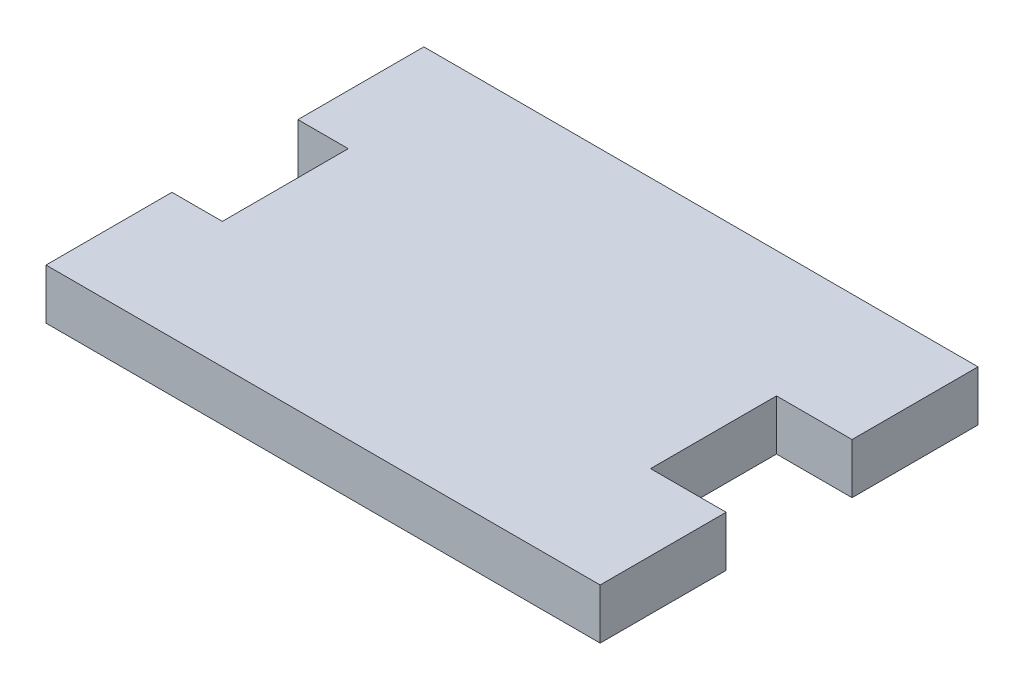
ISO-10303-21;
HEADER;
FILE_DESCRIPTION(('STEP AP214'),'2;1');
FILE_NAME('part.step','',(''),(''),'','','');
FILE_SCHEMA(('AUTOMOTIVE_DESIGN { 1 0 10303 214 1 1 1 1 }'));
ENDSEC;
DATA;
#1=APPLICATION_CONTEXT('core data for automotive mechanical design processes');
#2=APPLICATION_PROTOCOL_DEFINITION('international standard','automotive_design',2000,#1);
#3=PRODUCT_CONTEXT('',#1,'mechanical');
#4=PRODUCT('Part','Part','',(#3));
#5=PRODUCT_RELATED_PRODUCT_CATEGORY('part','',(#4));
#6=PRODUCT_DEFINITION_FORMATION('','',#4);
#7=PRODUCT_DEFINITION_CONTEXT('part definition',#1,'design');
#8=PRODUCT_DEFINITION('design','',#6,#7);
#9=PRODUCT_DEFINITION_SHAPE('','',#8);
#10=(LENGTH_UNIT() NAMED_UNIT(*) SI_UNIT(.MILLI.,.METRE.));
#11=(NAMED_UNIT(*) PLANE_ANGLE_UNIT() SI_UNIT($,.RADIAN.));
#12=(NAMED_UNIT(*) SI_UNIT($,.STERADIAN.) SOLID_ANGLE_UNIT());
#13=UNCERTAINTY_MEASURE_WITH_UNIT(LENGTH_MEASURE(1.E-05),#10,'distance_accuracy_value','');
#14=(GEOMETRIC_REPRESENTATION_CONTEXT(3) GLOBAL_UNCERTAINTY_ASSIGNED_CONTEXT((#13)) GLOBAL_UNIT_ASSIGNED_CONTEXT((#10,
#11,#12)) REPRESENTATION_CONTEXT('',''));
#15=CARTESIAN_POINT('',(0.,0.,0.));
#16=DIRECTION('',(0.,0.,1.));
#17=DIRECTION('',(1.,0.,0.));
#18=AXIS2_PLACEMENT_3D('',#15,#16,#17);
#19=CARTESIAN_POINT('',(11.,2.,7.5));
#20=DIRECTION('',(-1.,0.,0.));
#21=DIRECTION('',(0.,0.,1.));
#22=AXIS2_PLACEMENT_3D('',#19,#20,#21);
#23=PLANE('',#22);
#24=DIRECTION('',(0.,0.,-1.));
#25=VECTOR('',#24,1.);
#26=CARTESIAN_POINT('',(11.,0.,7.5));
#27=LINE('',#26,#25);
#28=CARTESIAN_POINT('',(11.,0.,7.5));
#29=VERTEX_POINT('',#28);
#30=CARTESIAN_POINT('',(11.,0.,2.5));
#31=VERTEX_POINT('',#30);
#32=EDGE_CURVE('E146',#29,#31,#27,.T.);
#33=ORIENTED_EDGE('',*,*,#32,.T.);
#34=DIRECTION('',(0.,1.,0.));
#35=VECTOR('',#34,1.);
#36=CARTESIAN_POINT('',(11.,0.,2.5));
#37=LINE('',#36,#35);
#38=CARTESIAN_POINT('',(11.,2.,2.5));
#39=VERTEX_POINT('',#38);
#40=EDGE_CURVE('E185',#31,#39,#37,.T.);
#41=ORIENTED_EDGE('',*,*,#40,.T.);
#42=DIRECTION('',(0.,0.,-1.));
#43=VECTOR('',#42,1.);
#44=CARTESIAN_POINT('',(11.,2.,7.5));
#45=LINE('',#44,#43);
#46=CARTESIAN_POINT('',(11.,2.,7.5));
#47=VERTEX_POINT('',#46);
#48=EDGE_CURVE('E168',#47,#39,#45,.T.);
#49=ORIENTED_EDGE('',*,*,#48,.F.);
#50=DIRECTION('',(0.,-1.,0.));
#51=VECTOR('',#50,1.);
#52=CARTESIAN_POINT('',(11.,2.,7.5));
#53=LINE('',#52,#51);
#54=EDGE_CURVE('E42',#47,#29,#53,.T.);
#55=ORIENTED_EDGE('',*,*,#54,.T.);
#56=EDGE_LOOP('',(#33,#41,#49,#55));
#57=FACE_BOUND('',#56,.T.);
#58=ADVANCED_FACE('F34',(#57),#23,.F.);
#59=CARTESIAN_POINT('',(-11.,2.,7.5));
#60=DIRECTION('',(1.,0.,0.));
#61=DIRECTION('',(0.,0.,-1.));
#62=AXIS2_PLACEMENT_3D('',#59,#60,#61);
#63=PLANE('',#62);
#64=DIRECTION('',(0.,0.,1.));
#65=VECTOR('',#64,1.);
#66=CARTESIAN_POINT('',(-11.,0.,7.5));
#67=LINE('',#66,#65);
#68=CARTESIAN_POINT('',(-11.,0.,-7.5));
#69=VERTEX_POINT('',#68);
#70=CARTESIAN_POINT('',(-11.,0.,-2.5));
#71=VERTEX_POINT('',#70);
#72=EDGE_CURVE('E150',#69,#71,#67,.T.);
#73=ORIENTED_EDGE('',*,*,#72,.T.);
#74=DIRECTION('',(0.,1.,0.));
#75=VECTOR('',#74,1.);
#76=CARTESIAN_POINT('',(-11.,0.,-2.5));
#77=LINE('',#76,#75);
#78=CARTESIAN_POINT('',(-11.,2.,-2.5));
#79=VERTEX_POINT('',#78);
#80=EDGE_CURVE('E206',#71,#79,#77,.T.);
#81=ORIENTED_EDGE('',*,*,#80,.T.);
#82=DIRECTION('',(0.,0.,1.));
#83=VECTOR('',#82,1.);
#84=CARTESIAN_POINT('',(-11.,2.,7.5));
#85=LINE('',#84,#83);
#86=CARTESIAN_POINT('',(-11.,2.,-7.5));
#87=VERTEX_POINT('',#86);
#88=EDGE_CURVE('E215',#87,#79,#85,.T.);
#89=ORIENTED_EDGE('',*,*,#88,.F.);
#90=DIRECTION('',(0.,-1.,0.));
#91=VECTOR('',#90,1.);
#92=CARTESIAN_POINT('',(-11.,2.,-7.5));
#93=LINE('',#92,#91);
#94=EDGE_CURVE('E156',#87,#69,#93,.T.);
#95=ORIENTED_EDGE('',*,*,#94,.T.);
#96=EDGE_LOOP('',(#73,#81,#89,#95));
#97=FACE_BOUND('',#96,.T.);
#98=ADVANCED_FACE('F240',(#97),#63,.F.);
#99=CARTESIAN_POINT('',(-11.,2.,2.5));
#100=VERTEX_POINT('',#99);
#101=CARTESIAN_POINT('',(-11.,2.,7.5));
#102=VERTEX_POINT('',#101);
#103=EDGE_CURVE('E155',#100,#102,#85,.T.);
#104=ORIENTED_EDGE('',*,*,#103,.F.);
#105=DIRECTION('',(0.,1.,0.));
#106=VECTOR('',#105,1.);
#107=CARTESIAN_POINT('',(-11.,0.,2.5));
#108=LINE('',#107,#106);
#109=CARTESIAN_POINT('',(-11.,0.,2.5));
#110=VERTEX_POINT('',#109);
#111=EDGE_CURVE('E199',#110,#100,#108,.T.);
#112=ORIENTED_EDGE('',*,*,#111,.F.);
#113=CARTESIAN_POINT('',(-11.,0.,7.5));
#114=VERTEX_POINT('',#113);
#115=EDGE_CURVE('E209',#110,#114,#67,.T.);
#116=ORIENTED_EDGE('',*,*,#115,.T.);
#117=DIRECTION('',(0.,-1.,0.));
#118=VECTOR('',#117,1.);
#119=CARTESIAN_POINT('',(-11.,2.,7.5));
#120=LINE('',#119,#118);
#121=EDGE_CURVE('E11',#102,#114,#120,.T.);
#122=ORIENTED_EDGE('',*,*,#121,.F.);
#123=EDGE_LOOP('',(#104,#112,#116,#122));
#124=FACE_BOUND('',#123,.T.);
#125=ADVANCED_FACE('F36',(#124),#63,.F.);
#126=CARTESIAN_POINT('',(11.,2.,7.5));
#127=DIRECTION('',(0.,0.,-1.));
#128=DIRECTION('',(-1.,0.,0.));
#129=AXIS2_PLACEMENT_3D('',#126,#127,#128);
#130=PLANE('',#129);
#131=DIRECTION('',(1.,0.,0.));
#132=VECTOR('',#131,1.);
#133=CARTESIAN_POINT('',(11.,0.,7.5));
#134=LINE('',#133,#132);
#135=EDGE_CURVE('E147',#114,#29,#134,.T.);
#136=ORIENTED_EDGE('',*,*,#135,.T.);
#137=ORIENTED_EDGE('',*,*,#54,.F.);
#138=DIRECTION('',(1.,0.,0.));
#139=VECTOR('',#138,1.);
#140=CARTESIAN_POINT('',(11.,2.,7.5));
#141=LINE('',#140,#139);
#142=EDGE_CURVE('E218',#102,#47,#141,.T.);
#143=ORIENTED_EDGE('',*,*,#142,.F.);
#144=ORIENTED_EDGE('',*,*,#121,.T.);
#145=EDGE_LOOP('',(#136,#137,#143,#144));
#146=FACE_BOUND('',#145,.T.);
#147=ADVANCED_FACE('F248',(#146),#130,.F.);
#148=CARTESIAN_POINT('',(11.,2.,-2.5));
#149=VERTEX_POINT('',#148);
#150=CARTESIAN_POINT('',(11.,2.,-7.5));
#151=VERTEX_POINT('',#150);
#152=EDGE_CURVE('E139',#149,#151,#45,.T.);
#153=ORIENTED_EDGE('',*,*,#152,.F.);
#154=DIRECTION('',(0.,1.,0.));
#155=VECTOR('',#154,1.);
#156=CARTESIAN_POINT('',(11.,0.,-2.5));
#157=LINE('',#156,#155);
#158=CARTESIAN_POINT('',(11.,0.,-2.5));
#159=VERTEX_POINT('',#158);
#160=EDGE_CURVE('E126',#159,#149,#157,.T.);
#161=ORIENTED_EDGE('',*,*,#160,.F.);
#162=CARTESIAN_POINT('',(11.,0.,-7.5));
#163=VERTEX_POINT('',#162);
#164=EDGE_CURVE('E137',#159,#163,#27,.T.);
#165=ORIENTED_EDGE('',*,*,#164,.T.);
#166=DIRECTION('',(0.,-1.,0.));
#167=VECTOR('',#166,1.);
#168=CARTESIAN_POINT('',(11.,2.,-7.5));
#169=LINE('',#168,#167);
#170=EDGE_CURVE('E159',#151,#163,#169,.T.);
#171=ORIENTED_EDGE('',*,*,#170,.F.);
#172=EDGE_LOOP('',(#153,#161,#165,#171));
#173=FACE_BOUND('',#172,.T.);
#174=ADVANCED_FACE('F135',(#173),#23,.F.);
#175=CARTESIAN_POINT('',(11.,2.,-7.5));
#176=DIRECTION('',(0.,0.,1.));
#177=DIRECTION('',(1.,0.,0.));
#178=AXIS2_PLACEMENT_3D('',#175,#176,#177);
#179=PLANE('',#178);
#180=DIRECTION('',(-1.,0.,0.));
#181=VECTOR('',#180,1.);
#182=CARTESIAN_POINT('',(11.,0.,-7.5));
#183=LINE('',#182,#181);
#184=EDGE_CURVE('E145',#163,#69,#183,.T.);
#185=ORIENTED_EDGE('',*,*,#184,.T.);
#186=ORIENTED_EDGE('',*,*,#94,.F.);
#187=DIRECTION('',(-1.,0.,0.));
#188=VECTOR('',#187,1.);
#189=CARTESIAN_POINT('',(11.,2.,-7.5));
#190=LINE('',#189,#188);
#191=EDGE_CURVE('E160',#151,#87,#190,.T.);
#192=ORIENTED_EDGE('',*,*,#191,.F.);
#193=ORIENTED_EDGE('',*,*,#170,.T.);
#194=EDGE_LOOP('',(#185,#186,#192,#193));
#195=FACE_BOUND('',#194,.T.);
#196=ADVANCED_FACE('F244',(#195),#179,.F.);
#197=CARTESIAN_POINT('',(0.,2.,0.));
#198=DIRECTION('',(0.,1.,0.));
#199=DIRECTION('',(0.,0.,1.));
#200=AXIS2_PLACEMENT_3D('',#197,#198,#199);
#201=PLANE('',#200);
#202=DIRECTION('',(1.,0.,0.));
#203=VECTOR('',#202,1.);
#204=CARTESIAN_POINT('',(11.,2.,2.5));
#205=LINE('',#204,#203);
#206=CARTESIAN_POINT('',(8.,2.,2.5));
#207=VERTEX_POINT('',#206);
#208=EDGE_CURVE('E131',#207,#39,#205,.T.);
#209=ORIENTED_EDGE('',*,*,#208,.F.);
#210=DIRECTION('',(0.,0.,1.));
#211=VECTOR('',#210,1.);
#212=CARTESIAN_POINT('',(8.,2.,-2.5));
#213=LINE('',#212,#211);
#214=CARTESIAN_POINT('',(8.,2.,-2.5));
#215=VERTEX_POINT('',#214);
#216=EDGE_CURVE('E181',#215,#207,#213,.T.);
#217=ORIENTED_EDGE('',*,*,#216,.F.);
#218=DIRECTION('',(-1.,0.,0.));
#219=VECTOR('',#218,1.);
#220=CARTESIAN_POINT('',(11.,2.,-2.5));
#221=LINE('',#220,#219);
#222=EDGE_CURVE('E179',#149,#215,#221,.T.);
#223=ORIENTED_EDGE('',*,*,#222,.F.);
#224=ORIENTED_EDGE('',*,*,#152,.T.);
#225=ORIENTED_EDGE('',*,*,#191,.T.);
#226=ORIENTED_EDGE('',*,*,#88,.T.);
#227=DIRECTION('',(-1.,0.,0.));
#228=VECTOR('',#227,1.);
#229=CARTESIAN_POINT('',(-9.,2.,-2.5));
#230=LINE('',#229,#228);
#231=CARTESIAN_POINT('',(-9.,2.,-2.5));
#232=VERTEX_POINT('',#231);
#233=EDGE_CURVE('E194',#232,#79,#230,.T.);
#234=ORIENTED_EDGE('',*,*,#233,.F.);
#235=DIRECTION('',(0.,0.,-1.));
#236=VECTOR('',#235,1.);
#237=CARTESIAN_POINT('',(-9.,2.,2.5));
#238=LINE('',#237,#236);
#239=CARTESIAN_POINT('',(-9.,2.,2.5));
#240=VERTEX_POINT('',#239);
#241=EDGE_CURVE('E202',#240,#232,#238,.T.);
#242=ORIENTED_EDGE('',*,*,#241,.F.);
#243=DIRECTION('',(1.,0.,0.));
#244=VECTOR('',#243,1.);
#245=CARTESIAN_POINT('',(-9.,2.,2.5));
#246=LINE('',#245,#244);
#247=EDGE_CURVE('E187',#100,#240,#246,.T.);
#248=ORIENTED_EDGE('',*,*,#247,.F.);
#249=ORIENTED_EDGE('',*,*,#103,.T.);
#250=ORIENTED_EDGE('',*,*,#142,.T.);
#251=ORIENTED_EDGE('',*,*,#48,.T.);
#252=EDGE_LOOP('',(#209,#217,#223,#224,#225,#226,#234,#242,#248,#249,#250,#251));
#253=FACE_BOUND('',#252,.T.);
#254=ADVANCED_FACE('F236',(#253),#201,.T.);
#255=CARTESIAN_POINT('',(0.,0.,0.));
#256=DIRECTION('',(0.,1.,0.));
#257=DIRECTION('',(0.,0.,1.));
#258=AXIS2_PLACEMENT_3D('',#255,#256,#257);
#259=PLANE('',#258);
#260=DIRECTION('',(0.,0.,1.));
#261=VECTOR('',#260,1.);
#262=CARTESIAN_POINT('',(8.,0.,-2.5));
#263=LINE('',#262,#261);
#264=CARTESIAN_POINT('',(8.,0.,-2.5));
#265=VERTEX_POINT('',#264);
#266=CARTESIAN_POINT('',(8.,0.,2.5));
#267=VERTEX_POINT('',#266);
#268=EDGE_CURVE('E49',#265,#267,#263,.T.);
#269=ORIENTED_EDGE('',*,*,#268,.T.);
#270=DIRECTION('',(1.,0.,0.));
#271=VECTOR('',#270,1.);
#272=CARTESIAN_POINT('',(11.,0.,2.5));
#273=LINE('',#272,#271);
#274=EDGE_CURVE('E140',#267,#31,#273,.T.);
#275=ORIENTED_EDGE('',*,*,#274,.T.);
#276=ORIENTED_EDGE('',*,*,#32,.F.);
#277=ORIENTED_EDGE('',*,*,#135,.F.);
#278=ORIENTED_EDGE('',*,*,#115,.F.);
#279=DIRECTION('',(1.,0.,0.));
#280=VECTOR('',#279,1.);
#281=CARTESIAN_POINT('',(-9.,0.,2.5));
#282=LINE('',#281,#280);
#283=CARTESIAN_POINT('',(-9.,0.,2.5));
#284=VERTEX_POINT('',#283);
#285=EDGE_CURVE('E191',#110,#284,#282,.T.);
#286=ORIENTED_EDGE('',*,*,#285,.T.);
#287=DIRECTION('',(0.,0.,-1.));
#288=VECTOR('',#287,1.);
#289=CARTESIAN_POINT('',(-9.,0.,2.5));
#290=LINE('',#289,#288);
#291=CARTESIAN_POINT('',(-9.,0.,-2.5));
#292=VERTEX_POINT('',#291);
#293=EDGE_CURVE('E57',#284,#292,#290,.T.);
#294=ORIENTED_EDGE('',*,*,#293,.T.);
#295=DIRECTION('',(-1.,0.,0.));
#296=VECTOR('',#295,1.);
#297=CARTESIAN_POINT('',(-9.,0.,-2.5));
#298=LINE('',#297,#296);
#299=EDGE_CURVE('E196',#292,#71,#298,.T.);
#300=ORIENTED_EDGE('',*,*,#299,.T.);
#301=ORIENTED_EDGE('',*,*,#72,.F.);
#302=ORIENTED_EDGE('',*,*,#184,.F.);
#303=ORIENTED_EDGE('',*,*,#164,.F.);
#304=DIRECTION('',(-1.,0.,0.));
#305=VECTOR('',#304,1.);
#306=CARTESIAN_POINT('',(11.,0.,-2.5));
#307=LINE('',#306,#305);
#308=EDGE_CURVE('E122',#159,#265,#307,.T.);
#309=ORIENTED_EDGE('',*,*,#308,.T.);
#310=EDGE_LOOP('',(#269,#275,#276,#277,#278,#286,#294,#300,#301,#302,#303,#309));
#311=FACE_BOUND('',#310,.T.);
#312=ADVANCED_FACE('F143',(#311),#259,.F.);
#313=CARTESIAN_POINT('',(-9.,0.,-2.5));
#314=DIRECTION('',(0.,0.,-1.));
#315=DIRECTION('',(-1.,0.,0.));
#316=AXIS2_PLACEMENT_3D('',#313,#314,#315);
#317=PLANE('',#316);
#318=ORIENTED_EDGE('',*,*,#233,.T.);
#319=ORIENTED_EDGE('',*,*,#80,.F.);
#320=ORIENTED_EDGE('',*,*,#299,.F.);
#321=DIRECTION('',(0.,1.,0.));
#322=VECTOR('',#321,1.);
#323=CARTESIAN_POINT('',(-9.,0.,-2.5));
#324=LINE('',#323,#322);
#325=EDGE_CURVE('E210',#292,#232,#324,.T.);
#326=ORIENTED_EDGE('',*,*,#325,.T.);
#327=EDGE_LOOP('',(#318,#319,#320,#326));
#328=FACE_BOUND('',#327,.T.);
#329=ADVANCED_FACE('F239',(#328),#317,.F.);
#330=CARTESIAN_POINT('',(-9.,0.,2.5));
#331=DIRECTION('',(1.,0.,0.));
#332=DIRECTION('',(0.,0.,-1.));
#333=AXIS2_PLACEMENT_3D('',#330,#331,#332);
#334=PLANE('',#333);
#335=ORIENTED_EDGE('',*,*,#241,.T.);
#336=ORIENTED_EDGE('',*,*,#325,.F.);
#337=ORIENTED_EDGE('',*,*,#293,.F.);
#338=DIRECTION('',(0.,1.,0.));
#339=VECTOR('',#338,1.);
#340=CARTESIAN_POINT('',(-9.,0.,2.5));
#341=LINE('',#340,#339);
#342=EDGE_CURVE('E212',#284,#240,#341,.T.);
#343=ORIENTED_EDGE('',*,*,#342,.T.);
#344=EDGE_LOOP('',(#335,#336,#337,#343));
#345=FACE_BOUND('',#344,.T.);
#346=ADVANCED_FACE('F231',(#345),#334,.F.);
#347=CARTESIAN_POINT('',(-9.,0.,2.5));
#348=DIRECTION('',(0.,0.,1.));
#349=DIRECTION('',(1.,0.,0.));
#350=AXIS2_PLACEMENT_3D('',#347,#348,#349);
#351=PLANE('',#350);
#352=ORIENTED_EDGE('',*,*,#247,.T.);
#353=ORIENTED_EDGE('',*,*,#342,.F.);
#354=ORIENTED_EDGE('',*,*,#285,.F.);
#355=ORIENTED_EDGE('',*,*,#111,.T.);
#356=EDGE_LOOP('',(#352,#353,#354,#355));
#357=FACE_BOUND('',#356,.T.);
#358=ADVANCED_FACE('F228',(#357),#351,.F.);
#359=CARTESIAN_POINT('',(11.,0.,2.5));
#360=DIRECTION('',(0.,0.,1.));
#361=DIRECTION('',(1.,0.,0.));
#362=AXIS2_PLACEMENT_3D('',#359,#360,#361);
#363=PLANE('',#362);
#364=ORIENTED_EDGE('',*,*,#208,.T.);
#365=ORIENTED_EDGE('',*,*,#40,.F.);
#366=ORIENTED_EDGE('',*,*,#274,.F.);
#367=DIRECTION('',(0.,1.,0.));
#368=VECTOR('',#367,1.);
#369=CARTESIAN_POINT('',(8.,0.,2.5));
#370=LINE('',#369,#368);
#371=EDGE_CURVE('E188',#267,#207,#370,.T.);
#372=ORIENTED_EDGE('',*,*,#371,.T.);
#373=EDGE_LOOP('',(#364,#365,#366,#372));
#374=FACE_BOUND('',#373,.T.);
#375=ADVANCED_FACE('F247',(#374),#363,.F.);
#376=CARTESIAN_POINT('',(8.,0.,-2.5));
#377=DIRECTION('',(-1.,0.,0.));
#378=DIRECTION('',(0.,0.,1.));
#379=AXIS2_PLACEMENT_3D('',#376,#377,#378);
#380=PLANE('',#379);
#381=ORIENTED_EDGE('',*,*,#216,.T.);
#382=ORIENTED_EDGE('',*,*,#371,.F.);
#383=ORIENTED_EDGE('',*,*,#268,.F.);
#384=DIRECTION('',(0.,1.,0.));
#385=VECTOR('',#384,1.);
#386=CARTESIAN_POINT('',(8.,0.,-2.5));
#387=LINE('',#386,#385);
#388=EDGE_CURVE('E128',#265,#215,#387,.T.);
#389=ORIENTED_EDGE('',*,*,#388,.T.);
#390=EDGE_LOOP('',(#381,#382,#383,#389));
#391=FACE_BOUND('',#390,.T.);
#392=ADVANCED_FACE('F246',(#391),#380,.F.);
#393=CARTESIAN_POINT('',(11.,0.,-2.5));
#394=DIRECTION('',(0.,0.,-1.));
#395=DIRECTION('',(-1.,0.,0.));
#396=AXIS2_PLACEMENT_3D('',#393,#394,#395);
#397=PLANE('',#396);
#398=ORIENTED_EDGE('',*,*,#222,.T.);
#399=ORIENTED_EDGE('',*,*,#388,.F.);
#400=ORIENTED_EDGE('',*,*,#308,.F.);
#401=ORIENTED_EDGE('',*,*,#160,.T.);
#402=EDGE_LOOP('',(#398,#399,#400,#401));
#403=FACE_BOUND('',#402,.T.);
#404=ADVANCED_FACE('F125',(#403),#397,.F.);
#405=CLOSED_SHELL('',(#58,#98,#125,#147,#174,#196,#254,#312,#329,#346,#358,#375,#392,#404));
#406=MANIFOLD_SOLID_BREP('B2',#405);
#407=ADVANCED_BREP_SHAPE_REPRESENTATION('',(#18,#406),#14);
#408=SHAPE_DEFINITION_REPRESENTATION(#9,#407);
ENDSEC;
END-ISO-10303-21;
